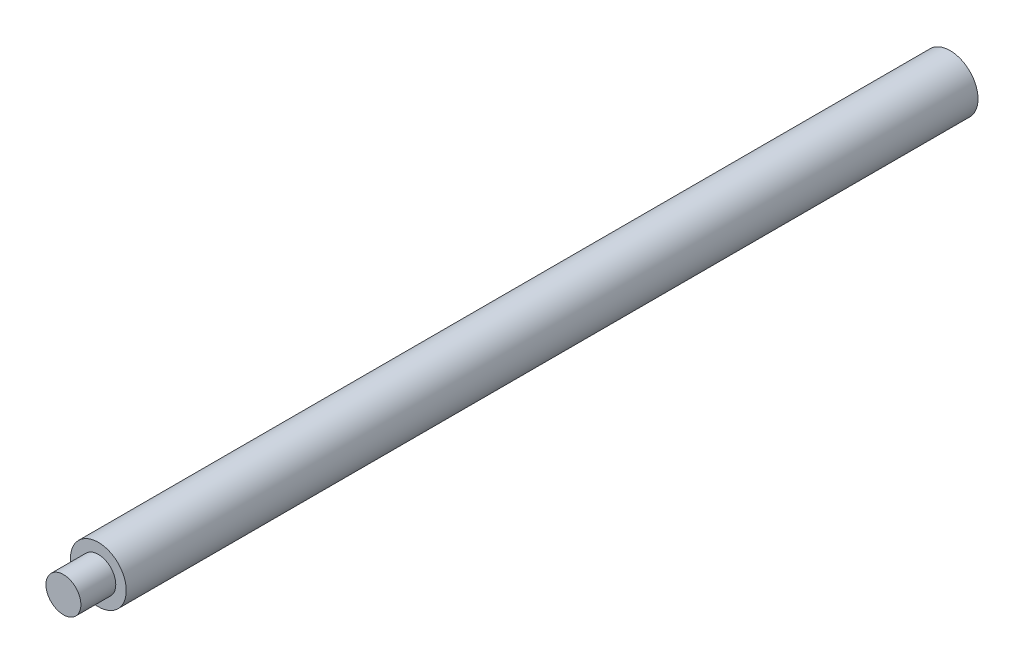
ISO-10303-21;
HEADER;
FILE_DESCRIPTION(('STEP AP214'),'2;1');
FILE_NAME('part.step','',(''),(''),'','','');
FILE_SCHEMA(('AUTOMOTIVE_DESIGN { 1 0 10303 214 1 1 1 1 }'));
ENDSEC;
DATA;
#1=APPLICATION_CONTEXT('core data for automotive mechanical design processes');
#2=APPLICATION_PROTOCOL_DEFINITION('international standard','automotive_design',2000,#1);
#3=PRODUCT_CONTEXT('',#1,'mechanical');
#4=PRODUCT('Part','Part','',(#3));
#5=PRODUCT_RELATED_PRODUCT_CATEGORY('part','',(#4));
#6=PRODUCT_DEFINITION_FORMATION('','',#4);
#7=PRODUCT_DEFINITION_CONTEXT('part definition',#1,'design');
#8=PRODUCT_DEFINITION('design','',#6,#7);
#9=PRODUCT_DEFINITION_SHAPE('','',#8);
#10=(LENGTH_UNIT() NAMED_UNIT(*) SI_UNIT(.MILLI.,.METRE.));
#11=(NAMED_UNIT(*) PLANE_ANGLE_UNIT() SI_UNIT($,.RADIAN.));
#12=(NAMED_UNIT(*) SI_UNIT($,.STERADIAN.) SOLID_ANGLE_UNIT());
#13=UNCERTAINTY_MEASURE_WITH_UNIT(LENGTH_MEASURE(1.E-05),#10,'distance_accuracy_value','');
#14=(GEOMETRIC_REPRESENTATION_CONTEXT(3) GLOBAL_UNCERTAINTY_ASSIGNED_CONTEXT((#13)) GLOBAL_UNIT_ASSIGNED_CONTEXT((#10,
#11,#12)) REPRESENTATION_CONTEXT('',''));
#15=CARTESIAN_POINT('',(0.,0.,0.));
#16=DIRECTION('',(0.,0.,1.));
#17=DIRECTION('',(1.,0.,0.));
#18=AXIS2_PLACEMENT_3D('',#15,#16,#17);
#19=CARTESIAN_POINT('',(0.,0.,127.));
#20=DIRECTION('',(0.,0.,-1.));
#21=DIRECTION('',(-1.,0.,0.));
#22=AXIS2_PLACEMENT_3D('',#19,#20,#21);
#23=CYLINDRICAL_SURFACE('',#22,4.);
#24=CARTESIAN_POINT('',(0.,0.,0.));
#25=DIRECTION('',(0.,0.,1.));
#26=DIRECTION('',(1.,0.,0.));
#27=AXIS2_PLACEMENT_3D('',#24,#25,#26);
#28=CIRCLE('',#27,4.);
#29=CARTESIAN_POINT('',(4.,0.,0.));
#30=VERTEX_POINT('',#29);
#31=EDGE_CURVE('E10',#30,#30,#28,.T.);
#32=ORIENTED_EDGE('',*,*,#31,.T.);
#33=EDGE_LOOP('',(#32));
#34=FACE_BOUND('',#33,.T.);
#35=CARTESIAN_POINT('',(0.,0.,122.));
#36=DIRECTION('',(0.,0.,1.));
#37=DIRECTION('',(1.,0.,0.));
#38=AXIS2_PLACEMENT_3D('',#35,#36,#37);
#39=CIRCLE('',#38,4.);
#40=CARTESIAN_POINT('',(4.,0.,122.));
#41=VERTEX_POINT('',#40);
#42=EDGE_CURVE('E37',#41,#41,#39,.T.);
#43=ORIENTED_EDGE('',*,*,#42,.F.);
#44=EDGE_LOOP('',(#43));
#45=FACE_BOUND('',#44,.T.);
#46=ADVANCED_FACE('F31',(#34,#45),#23,.T.);
#47=CARTESIAN_POINT('',(0.,0.,0.));
#48=DIRECTION('',(0.,0.,1.));
#49=DIRECTION('',(1.,0.,0.));
#50=AXIS2_PLACEMENT_3D('',#47,#48,#49);
#51=PLANE('',#50);
#52=ORIENTED_EDGE('',*,*,#31,.F.);
#53=EDGE_LOOP('',(#52));
#54=FACE_BOUND('',#53,.T.);
#55=ADVANCED_FACE('F63',(#54),#51,.F.);
#56=CARTESIAN_POINT('',(0.,0.,122.));
#57=DIRECTION('',(0.,0.,1.));
#58=DIRECTION('',(1.,0.,0.));
#59=AXIS2_PLACEMENT_3D('',#56,#57,#58);
#60=PLANE('',#59);
#61=CARTESIAN_POINT('',(0.,0.,122.));
#62=DIRECTION('',(0.,0.,1.));
#63=DIRECTION('',(1.,0.,0.));
#64=AXIS2_PLACEMENT_3D('',#61,#62,#63);
#65=CIRCLE('',#64,2.5);
#66=CARTESIAN_POINT('',(2.5,0.,122.));
#67=VERTEX_POINT('',#66);
#68=EDGE_CURVE('E41',#67,#67,#65,.T.);
#69=ORIENTED_EDGE('',*,*,#68,.F.);
#70=EDGE_LOOP('',(#69));
#71=FACE_BOUND('',#70,.T.);
#72=ORIENTED_EDGE('',*,*,#42,.T.);
#73=EDGE_LOOP('',(#72));
#74=FACE_BOUND('',#73,.T.);
#75=ADVANCED_FACE('F55',(#71,#74),#60,.T.);
#76=CARTESIAN_POINT('',(0.,0.,122.));
#77=DIRECTION('',(0.,0.,1.));
#78=DIRECTION('',(1.,0.,0.));
#79=AXIS2_PLACEMENT_3D('',#76,#77,#78);
#80=CYLINDRICAL_SURFACE('',#79,2.5);
#81=ORIENTED_EDGE('',*,*,#68,.T.);
#82=EDGE_LOOP('',(#81));
#83=FACE_BOUND('',#82,.T.);
#84=CARTESIAN_POINT('',(0.,0.,127.));
#85=DIRECTION('',(0.,0.,1.));
#86=DIRECTION('',(1.,0.,0.));
#87=AXIS2_PLACEMENT_3D('',#84,#85,#86);
#88=CIRCLE('',#87,2.5);
#89=CARTESIAN_POINT('',(2.5,0.,127.));
#90=VERTEX_POINT('',#89);
#91=EDGE_CURVE('E45',#90,#90,#88,.T.);
#92=ORIENTED_EDGE('',*,*,#91,.F.);
#93=EDGE_LOOP('',(#92));
#94=FACE_BOUND('',#93,.T.);
#95=ADVANCED_FACE('F53',(#83,#94),#80,.T.);
#96=CARTESIAN_POINT('',(0.,0.,127.));
#97=DIRECTION('',(0.,0.,1.));
#98=DIRECTION('',(1.,0.,0.));
#99=AXIS2_PLACEMENT_3D('',#96,#97,#98);
#100=PLANE('',#99);
#101=ORIENTED_EDGE('',*,*,#91,.T.);
#102=EDGE_LOOP('',(#101));
#103=FACE_BOUND('',#102,.T.);
#104=ADVANCED_FACE('F51',(#103),#100,.T.);
#105=CLOSED_SHELL('',(#46,#55,#75,#95,#104));
#106=MANIFOLD_SOLID_BREP('B2',#105);
#107=ADVANCED_BREP_SHAPE_REPRESENTATION('',(#18,#106),#14);
#108=SHAPE_DEFINITION_REPRESENTATION(#9,#107);
ENDSEC;
END-ISO-10303-21;
